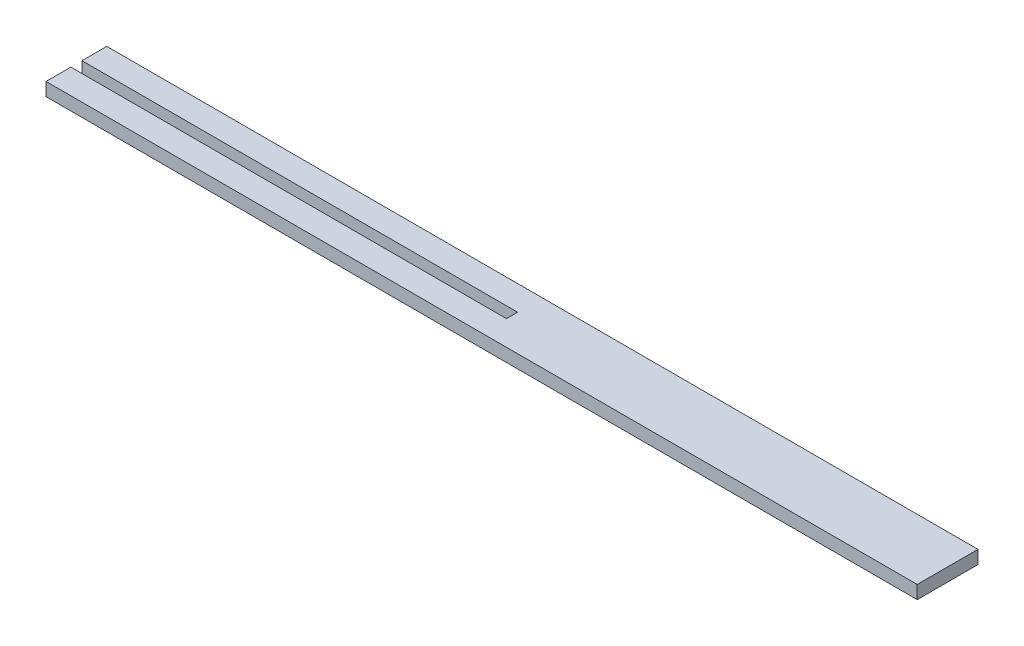
ISO-10303-21;
HEADER;
FILE_DESCRIPTION(('STEP AP214'),'2;1');
FILE_NAME('part.step','',(''),(''),'','','');
FILE_SCHEMA(('AUTOMOTIVE_DESIGN { 1 0 10303 214 1 1 1 1 }'));
ENDSEC;
DATA;
#1=APPLICATION_CONTEXT('core data for automotive mechanical design processes');
#2=APPLICATION_PROTOCOL_DEFINITION('international standard','automotive_design',2000,#1);
#3=PRODUCT_CONTEXT('',#1,'mechanical');
#4=PRODUCT('Part','Part','',(#3));
#5=PRODUCT_RELATED_PRODUCT_CATEGORY('part','',(#4));
#6=PRODUCT_DEFINITION_FORMATION('','',#4);
#7=PRODUCT_DEFINITION_CONTEXT('part definition',#1,'design');
#8=PRODUCT_DEFINITION('design','',#6,#7);
#9=PRODUCT_DEFINITION_SHAPE('','',#8);
#10=(LENGTH_UNIT() NAMED_UNIT(*) SI_UNIT(.MILLI.,.METRE.));
#11=(NAMED_UNIT(*) PLANE_ANGLE_UNIT() SI_UNIT($,.RADIAN.));
#12=(NAMED_UNIT(*) SI_UNIT($,.STERADIAN.) SOLID_ANGLE_UNIT());
#13=UNCERTAINTY_MEASURE_WITH_UNIT(LENGTH_MEASURE(1.E-05),#10,'distance_accuracy_value','');
#14=(GEOMETRIC_REPRESENTATION_CONTEXT(3) GLOBAL_UNCERTAINTY_ASSIGNED_CONTEXT((#13)) GLOBAL_UNIT_ASSIGNED_CONTEXT((#10,
#11,#12)) REPRESENTATION_CONTEXT('',''));
#15=CARTESIAN_POINT('',(0.,0.,0.));
#16=DIRECTION('',(0.,0.,1.));
#17=DIRECTION('',(1.,0.,0.));
#18=AXIS2_PLACEMENT_3D('',#15,#16,#17);
#19=CARTESIAN_POINT('',(-43.,1.3,-3.));
#20=DIRECTION('',(1.,0.,0.));
#21=DIRECTION('',(0.,0.,-1.));
#22=AXIS2_PLACEMENT_3D('',#19,#20,#21);
#23=PLANE('',#22);
#24=DIRECTION('',(0.,0.,1.));
#25=VECTOR('',#24,1.);
#26=CARTESIAN_POINT('',(-43.,0.,-3.));
#27=LINE('',#26,#25);
#28=CARTESIAN_POINT('',(-43.,0.,-3.));
#29=VERTEX_POINT('',#28);
#30=CARTESIAN_POINT('',(-43.,0.,-0.55));
#31=VERTEX_POINT('',#30);
#32=EDGE_CURVE('E134',#29,#31,#27,.T.);
#33=ORIENTED_EDGE('',*,*,#32,.T.);
#34=DIRECTION('',(0.,1.,0.));
#35=VECTOR('',#34,1.);
#36=CARTESIAN_POINT('',(-43.,0.,-0.55));
#37=LINE('',#36,#35);
#38=CARTESIAN_POINT('',(-43.,1.3,-0.55));
#39=VERTEX_POINT('',#38);
#40=EDGE_CURVE('E166',#31,#39,#37,.T.);
#41=ORIENTED_EDGE('',*,*,#40,.T.);
#42=DIRECTION('',(0.,0.,1.));
#43=VECTOR('',#42,1.);
#44=CARTESIAN_POINT('',(-43.,1.3,-3.));
#45=LINE('',#44,#43);
#46=CARTESIAN_POINT('',(-43.,1.3,-3.));
#47=VERTEX_POINT('',#46);
#48=EDGE_CURVE('E153',#47,#39,#45,.T.);
#49=ORIENTED_EDGE('',*,*,#48,.F.);
#50=DIRECTION('',(0.,-1.,0.));
#51=VECTOR('',#50,1.);
#52=CARTESIAN_POINT('',(-43.,1.3,-3.));
#53=LINE('',#52,#51);
#54=EDGE_CURVE('E48',#47,#29,#53,.T.);
#55=ORIENTED_EDGE('',*,*,#54,.T.);
#56=EDGE_LOOP('',(#33,#41,#49,#55));
#57=FACE_BOUND('',#56,.T.);
#58=ADVANCED_FACE('F40',(#57),#23,.F.);
#59=CARTESIAN_POINT('',(43.,1.3,-3.));
#60=DIRECTION('',(-1.,0.,0.));
#61=DIRECTION('',(0.,0.,1.));
#62=AXIS2_PLACEMENT_3D('',#59,#60,#61);
#63=PLANE('',#62);
#64=DIRECTION('',(0.,0.,-1.));
#65=VECTOR('',#64,1.);
#66=CARTESIAN_POINT('',(43.,0.,-3.));
#67=LINE('',#66,#65);
#68=CARTESIAN_POINT('',(43.,0.,3.));
#69=VERTEX_POINT('',#68);
#70=CARTESIAN_POINT('',(43.,0.,-3.));
#71=VERTEX_POINT('',#70);
#72=EDGE_CURVE('E138',#69,#71,#67,.T.);
#73=ORIENTED_EDGE('',*,*,#72,.T.);
#74=DIRECTION('',(0.,-1.,0.));
#75=VECTOR('',#74,1.);
#76=CARTESIAN_POINT('',(43.,1.3,-3.));
#77=LINE('',#76,#75);
#78=CARTESIAN_POINT('',(43.,1.3,-3.));
#79=VERTEX_POINT('',#78);
#80=EDGE_CURVE('E11',#79,#71,#77,.T.);
#81=ORIENTED_EDGE('',*,*,#80,.F.);
#82=DIRECTION('',(0.,0.,-1.));
#83=VECTOR('',#82,1.);
#84=CARTESIAN_POINT('',(43.,1.3,-3.));
#85=LINE('',#84,#83);
#86=CARTESIAN_POINT('',(43.,1.3,3.));
#87=VERTEX_POINT('',#86);
#88=EDGE_CURVE('E143',#87,#79,#85,.T.);
#89=ORIENTED_EDGE('',*,*,#88,.F.);
#90=DIRECTION('',(0.,-1.,0.));
#91=VECTOR('',#90,1.);
#92=CARTESIAN_POINT('',(43.,1.3,3.));
#93=LINE('',#92,#91);
#94=EDGE_CURVE('E144',#87,#69,#93,.T.);
#95=ORIENTED_EDGE('',*,*,#94,.T.);
#96=EDGE_LOOP('',(#73,#81,#89,#95));
#97=FACE_BOUND('',#96,.T.);
#98=ADVANCED_FACE('F42',(#97),#63,.F.);
#99=CARTESIAN_POINT('',(-43.,1.3,-3.));
#100=DIRECTION('',(0.,0.,1.));
#101=DIRECTION('',(1.,0.,0.));
#102=AXIS2_PLACEMENT_3D('',#99,#100,#101);
#103=PLANE('',#102);
#104=DIRECTION('',(-1.,0.,0.));
#105=VECTOR('',#104,1.);
#106=CARTESIAN_POINT('',(-43.,0.,-3.));
#107=LINE('',#106,#105);
#108=EDGE_CURVE('E135',#71,#29,#107,.T.);
#109=ORIENTED_EDGE('',*,*,#108,.T.);
#110=ORIENTED_EDGE('',*,*,#54,.F.);
#111=DIRECTION('',(-1.,0.,0.));
#112=VECTOR('',#111,1.);
#113=CARTESIAN_POINT('',(-43.,1.3,-3.));
#114=LINE('',#113,#112);
#115=EDGE_CURVE('E92',#79,#47,#114,.T.);
#116=ORIENTED_EDGE('',*,*,#115,.F.);
#117=ORIENTED_EDGE('',*,*,#80,.T.);
#118=EDGE_LOOP('',(#109,#110,#116,#117));
#119=FACE_BOUND('',#118,.T.);
#120=ADVANCED_FACE('F187',(#119),#103,.F.);
#121=CARTESIAN_POINT('',(-43.,1.3,0.55));
#122=VERTEX_POINT('',#121);
#123=CARTESIAN_POINT('',(-43.,1.3,3.));
#124=VERTEX_POINT('',#123);
#125=EDGE_CURVE('E129',#122,#124,#45,.T.);
#126=ORIENTED_EDGE('',*,*,#125,.F.);
#127=DIRECTION('',(0.,1.,0.));
#128=VECTOR('',#127,1.);
#129=CARTESIAN_POINT('',(-43.,0.,0.55));
#130=LINE('',#129,#128);
#131=CARTESIAN_POINT('',(-43.,0.,0.55));
#132=VERTEX_POINT('',#131);
#133=EDGE_CURVE('E117',#132,#122,#130,.T.);
#134=ORIENTED_EDGE('',*,*,#133,.F.);
#135=CARTESIAN_POINT('',(-43.,0.,3.));
#136=VERTEX_POINT('',#135);
#137=EDGE_CURVE('E128',#132,#136,#27,.T.);
#138=ORIENTED_EDGE('',*,*,#137,.T.);
#139=DIRECTION('',(0.,-1.,0.));
#140=VECTOR('',#139,1.);
#141=CARTESIAN_POINT('',(-43.,1.3,3.));
#142=LINE('',#141,#140);
#143=EDGE_CURVE('E146',#124,#136,#142,.T.);
#144=ORIENTED_EDGE('',*,*,#143,.F.);
#145=EDGE_LOOP('',(#126,#134,#138,#144));
#146=FACE_BOUND('',#145,.T.);
#147=ADVANCED_FACE('F126',(#146),#23,.F.);
#148=CARTESIAN_POINT('',(-43.,1.3,3.));
#149=DIRECTION('',(0.,0.,-1.));
#150=DIRECTION('',(-1.,0.,0.));
#151=AXIS2_PLACEMENT_3D('',#148,#149,#150);
#152=PLANE('',#151);
#153=DIRECTION('',(1.,0.,0.));
#154=VECTOR('',#153,1.);
#155=CARTESIAN_POINT('',(-43.,0.,3.));
#156=LINE('',#155,#154);
#157=EDGE_CURVE('E85',#136,#69,#156,.T.);
#158=ORIENTED_EDGE('',*,*,#157,.T.);
#159=ORIENTED_EDGE('',*,*,#94,.F.);
#160=DIRECTION('',(1.,0.,0.));
#161=VECTOR('',#160,1.);
#162=CARTESIAN_POINT('',(-43.,1.3,3.));
#163=LINE('',#162,#161);
#164=EDGE_CURVE('E64',#124,#87,#163,.T.);
#165=ORIENTED_EDGE('',*,*,#164,.F.);
#166=ORIENTED_EDGE('',*,*,#143,.T.);
#167=EDGE_LOOP('',(#158,#159,#165,#166));
#168=FACE_BOUND('',#167,.T.);
#169=ADVANCED_FACE('F178',(#168),#152,.F.);
#170=CARTESIAN_POINT('',(0.,1.3,0.));
#171=DIRECTION('',(0.,1.,0.));
#172=DIRECTION('',(0.,0.,1.));
#173=AXIS2_PLACEMENT_3D('',#170,#171,#172);
#174=PLANE('',#173);
#175=DIRECTION('',(-1.,0.,0.));
#176=VECTOR('',#175,1.);
#177=CARTESIAN_POINT('',(-43.,1.3,-0.55));
#178=LINE('',#177,#176);
#179=CARTESIAN_POINT('',(0.,1.3,-0.55));
#180=VERTEX_POINT('',#179);
#181=EDGE_CURVE('E122',#180,#39,#178,.T.);
#182=ORIENTED_EDGE('',*,*,#181,.F.);
#183=DIRECTION('',(0.,0.,-1.));
#184=VECTOR('',#183,1.);
#185=CARTESIAN_POINT('',(0.,1.3,-0.55));
#186=LINE('',#185,#184);
#187=CARTESIAN_POINT('',(0.,1.3,0.55));
#188=VERTEX_POINT('',#187);
#189=EDGE_CURVE('E162',#188,#180,#186,.T.);
#190=ORIENTED_EDGE('',*,*,#189,.F.);
#191=DIRECTION('',(1.,0.,0.));
#192=VECTOR('',#191,1.);
#193=CARTESIAN_POINT('',(-43.,1.3,0.55));
#194=LINE('',#193,#192);
#195=EDGE_CURVE('E160',#122,#188,#194,.T.);
#196=ORIENTED_EDGE('',*,*,#195,.F.);
#197=ORIENTED_EDGE('',*,*,#125,.T.);
#198=ORIENTED_EDGE('',*,*,#164,.T.);
#199=ORIENTED_EDGE('',*,*,#88,.T.);
#200=ORIENTED_EDGE('',*,*,#115,.T.);
#201=ORIENTED_EDGE('',*,*,#48,.T.);
#202=EDGE_LOOP('',(#182,#190,#196,#197,#198,#199,#200,#201));
#203=FACE_BOUND('',#202,.T.);
#204=ADVANCED_FACE('F180',(#203),#174,.T.);
#205=CARTESIAN_POINT('',(0.,0.,0.));
#206=DIRECTION('',(0.,1.,0.));
#207=DIRECTION('',(0.,0.,1.));
#208=AXIS2_PLACEMENT_3D('',#205,#206,#207);
#209=PLANE('',#208);
#210=DIRECTION('',(0.,0.,-1.));
#211=VECTOR('',#210,1.);
#212=CARTESIAN_POINT('',(0.,0.,-0.55));
#213=LINE('',#212,#211);
#214=CARTESIAN_POINT('',(0.,0.,0.55));
#215=VERTEX_POINT('',#214);
#216=CARTESIAN_POINT('',(0.,0.,-0.55));
#217=VERTEX_POINT('',#216);
#218=EDGE_CURVE('E55',#215,#217,#213,.T.);
#219=ORIENTED_EDGE('',*,*,#218,.T.);
#220=DIRECTION('',(-1.,0.,0.));
#221=VECTOR('',#220,1.);
#222=CARTESIAN_POINT('',(-43.,0.,-0.55));
#223=LINE('',#222,#221);
#224=EDGE_CURVE('E130',#217,#31,#223,.T.);
#225=ORIENTED_EDGE('',*,*,#224,.T.);
#226=ORIENTED_EDGE('',*,*,#32,.F.);
#227=ORIENTED_EDGE('',*,*,#108,.F.);
#228=ORIENTED_EDGE('',*,*,#72,.F.);
#229=ORIENTED_EDGE('',*,*,#157,.F.);
#230=ORIENTED_EDGE('',*,*,#137,.F.);
#231=DIRECTION('',(1.,0.,0.));
#232=VECTOR('',#231,1.);
#233=CARTESIAN_POINT('',(-43.,0.,0.55));
#234=LINE('',#233,#232);
#235=EDGE_CURVE('E113',#132,#215,#234,.T.);
#236=ORIENTED_EDGE('',*,*,#235,.T.);
#237=EDGE_LOOP('',(#219,#225,#226,#227,#228,#229,#230,#236));
#238=FACE_BOUND('',#237,.T.);
#239=ADVANCED_FACE('F132',(#238),#209,.F.);
#240=CARTESIAN_POINT('',(-43.,0.,-0.55));
#241=DIRECTION('',(0.,0.,-1.));
#242=DIRECTION('',(-1.,0.,0.));
#243=AXIS2_PLACEMENT_3D('',#240,#241,#242);
#244=PLANE('',#243);
#245=ORIENTED_EDGE('',*,*,#181,.T.);
#246=ORIENTED_EDGE('',*,*,#40,.F.);
#247=ORIENTED_EDGE('',*,*,#224,.F.);
#248=DIRECTION('',(0.,1.,0.));
#249=VECTOR('',#248,1.);
#250=CARTESIAN_POINT('',(0.,0.,-0.55));
#251=LINE('',#250,#249);
#252=EDGE_CURVE('E168',#217,#180,#251,.T.);
#253=ORIENTED_EDGE('',*,*,#252,.T.);
#254=EDGE_LOOP('',(#245,#246,#247,#253));
#255=FACE_BOUND('',#254,.T.);
#256=ADVANCED_FACE('F223',(#255),#244,.F.);
#257=CARTESIAN_POINT('',(0.,0.,-0.55));
#258=DIRECTION('',(1.,0.,0.));
#259=DIRECTION('',(0.,0.,-1.));
#260=AXIS2_PLACEMENT_3D('',#257,#258,#259);
#261=PLANE('',#260);
#262=ORIENTED_EDGE('',*,*,#189,.T.);
#263=ORIENTED_EDGE('',*,*,#252,.F.);
#264=ORIENTED_EDGE('',*,*,#218,.F.);
#265=DIRECTION('',(0.,1.,0.));
#266=VECTOR('',#265,1.);
#267=CARTESIAN_POINT('',(0.,0.,0.55));
#268=LINE('',#267,#266);
#269=EDGE_CURVE('E119',#215,#188,#268,.T.);
#270=ORIENTED_EDGE('',*,*,#269,.T.);
#271=EDGE_LOOP('',(#262,#263,#264,#270));
#272=FACE_BOUND('',#271,.T.);
#273=ADVANCED_FACE('F233',(#272),#261,.F.);
#274=CARTESIAN_POINT('',(-43.,0.,0.55));
#275=DIRECTION('',(0.,0.,1.));
#276=DIRECTION('',(1.,0.,0.));
#277=AXIS2_PLACEMENT_3D('',#274,#275,#276);
#278=PLANE('',#277);
#279=ORIENTED_EDGE('',*,*,#195,.T.);
#280=ORIENTED_EDGE('',*,*,#269,.F.);
#281=ORIENTED_EDGE('',*,*,#235,.F.);
#282=ORIENTED_EDGE('',*,*,#133,.T.);
#283=EDGE_LOOP('',(#279,#280,#281,#282));
#284=FACE_BOUND('',#283,.T.);
#285=ADVANCED_FACE('F116',(#284),#278,.F.);
#286=CLOSED_SHELL('',(#58,#98,#120,#147,#169,#204,#239,#256,#273,#285));
#287=MANIFOLD_SOLID_BREP('B2',#286);
#288=ADVANCED_BREP_SHAPE_REPRESENTATION('',(#18,#287),#14);
#289=SHAPE_DEFINITION_REPRESENTATION(#9,#288);
ENDSEC;
END-ISO-10303-21;
